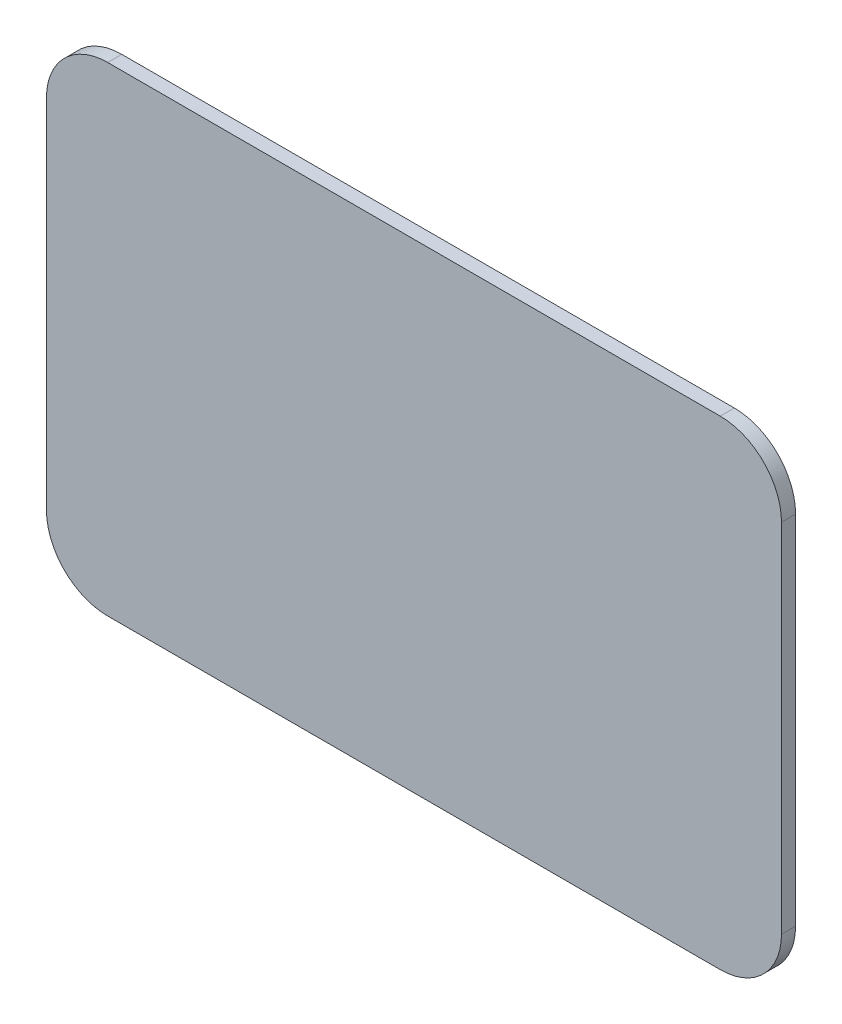
ISO-10303-21;
HEADER;
FILE_DESCRIPTION(('STEP AP214'),'2;1');
FILE_NAME('part.step','',(''),(''),'','','');
FILE_SCHEMA(('AUTOMOTIVE_DESIGN { 1 0 10303 214 1 1 1 1 }'));
ENDSEC;
DATA;
#1=APPLICATION_CONTEXT('core data for automotive mechanical design processes');
#2=APPLICATION_PROTOCOL_DEFINITION('international standard','automotive_design',2000,#1);
#3=PRODUCT_CONTEXT('',#1,'mechanical');
#4=PRODUCT('Part','Part','',(#3));
#5=PRODUCT_RELATED_PRODUCT_CATEGORY('part','',(#4));
#6=PRODUCT_DEFINITION_FORMATION('','',#4);
#7=PRODUCT_DEFINITION_CONTEXT('part definition',#1,'design');
#8=PRODUCT_DEFINITION('design','',#6,#7);
#9=PRODUCT_DEFINITION_SHAPE('','',#8);
#10=(LENGTH_UNIT() NAMED_UNIT(*) SI_UNIT(.MILLI.,.METRE.));
#11=(NAMED_UNIT(*) PLANE_ANGLE_UNIT() SI_UNIT($,.RADIAN.));
#12=(NAMED_UNIT(*) SI_UNIT($,.STERADIAN.) SOLID_ANGLE_UNIT());
#13=UNCERTAINTY_MEASURE_WITH_UNIT(LENGTH_MEASURE(1.E-05),#10,'distance_accuracy_value','');
#14=(GEOMETRIC_REPRESENTATION_CONTEXT(3) GLOBAL_UNCERTAINTY_ASSIGNED_CONTEXT((#13)) GLOBAL_UNIT_ASSIGNED_CONTEXT((#10,
#11,#12)) REPRESENTATION_CONTEXT('',''));
#15=CARTESIAN_POINT('',(0.,0.,0.));
#16=DIRECTION('',(0.,0.,1.));
#17=DIRECTION('',(1.,0.,0.));
#18=AXIS2_PLACEMENT_3D('',#15,#16,#17);
#19=CARTESIAN_POINT('',(-250.,-145.65,-10.));
#20=DIRECTION('',(0.,0.,1.));
#21=DIRECTION('',(1.,0.,0.));
#22=AXIS2_PLACEMENT_3D('',#19,#20,#21);
#23=CYLINDRICAL_SURFACE('',#22,50.);
#24=DIRECTION('',(0.,0.,1.));
#25=VECTOR('',#24,1.);
#26=CARTESIAN_POINT('',(-250.,-195.65,-10.));
#27=LINE('',#26,#25);
#28=CARTESIAN_POINT('',(-250.,-195.65,-10.));
#29=VERTEX_POINT('',#28);
#30=CARTESIAN_POINT('',(-250.,-195.65,1.5));
#31=VERTEX_POINT('',#30);
#32=EDGE_CURVE('E42',#29,#31,#27,.T.);
#33=ORIENTED_EDGE('',*,*,#32,.T.);
#34=CARTESIAN_POINT('',(-250.,-145.65,1.5));
#35=DIRECTION('',(0.,0.,1.));
#36=DIRECTION('',(1.,0.,0.));
#37=AXIS2_PLACEMENT_3D('',#34,#35,#36);
#38=CIRCLE('',#37,50.);
#39=CARTESIAN_POINT('',(-300.,-145.65,1.5));
#40=VERTEX_POINT('',#39);
#41=EDGE_CURVE('E104',#40,#31,#38,.T.);
#42=ORIENTED_EDGE('',*,*,#41,.F.);
#43=DIRECTION('',(0.,0.,1.));
#44=VECTOR('',#43,1.);
#45=CARTESIAN_POINT('',(-300.,-145.65,-10.));
#46=LINE('',#45,#44);
#47=CARTESIAN_POINT('',(-300.,-145.65,-10.));
#48=VERTEX_POINT('',#47);
#49=EDGE_CURVE('E11',#48,#40,#46,.T.);
#50=ORIENTED_EDGE('',*,*,#49,.F.);
#51=CARTESIAN_POINT('',(-250.,-145.65,-10.));
#52=DIRECTION('',(0.,0.,1.));
#53=DIRECTION('',(1.,0.,0.));
#54=AXIS2_PLACEMENT_3D('',#51,#52,#53);
#55=CIRCLE('',#54,50.);
#56=EDGE_CURVE('E105',#48,#29,#55,.T.);
#57=ORIENTED_EDGE('',*,*,#56,.T.);
#58=EDGE_LOOP('',(#33,#42,#50,#57));
#59=FACE_BOUND('',#58,.T.);
#60=ADVANCED_FACE('F39',(#59),#23,.T.);
#61=CARTESIAN_POINT('',(-300.,145.65,-10.));
#62=DIRECTION('',(-1.,0.,0.));
#63=DIRECTION('',(0.,-1.,0.));
#64=AXIS2_PLACEMENT_3D('',#61,#62,#63);
#65=PLANE('',#64);
#66=ORIENTED_EDGE('',*,*,#49,.T.);
#67=DIRECTION('',(0.,-1.,0.));
#68=VECTOR('',#67,1.);
#69=CARTESIAN_POINT('',(-300.,145.65,1.5));
#70=LINE('',#69,#68);
#71=CARTESIAN_POINT('',(-300.,145.65,1.5));
#72=VERTEX_POINT('',#71);
#73=EDGE_CURVE('E124',#72,#40,#70,.T.);
#74=ORIENTED_EDGE('',*,*,#73,.F.);
#75=DIRECTION('',(0.,0.,1.));
#76=VECTOR('',#75,1.);
#77=CARTESIAN_POINT('',(-300.,145.65,-10.));
#78=LINE('',#77,#76);
#79=CARTESIAN_POINT('',(-300.,145.65,-10.));
#80=VERTEX_POINT('',#79);
#81=EDGE_CURVE('E48',#80,#72,#78,.T.);
#82=ORIENTED_EDGE('',*,*,#81,.F.);
#83=DIRECTION('',(0.,-1.,0.));
#84=VECTOR('',#83,1.);
#85=CARTESIAN_POINT('',(-300.,145.65,-10.));
#86=LINE('',#85,#84);
#87=EDGE_CURVE('E111',#80,#48,#86,.T.);
#88=ORIENTED_EDGE('',*,*,#87,.T.);
#89=EDGE_LOOP('',(#66,#74,#82,#88));
#90=FACE_BOUND('',#89,.T.);
#91=ADVANCED_FACE('F209',(#90),#65,.T.);
#92=CARTESIAN_POINT('',(-250.,145.65,-10.));
#93=DIRECTION('',(0.,0.,1.));
#94=DIRECTION('',(1.,0.,0.));
#95=AXIS2_PLACEMENT_3D('',#92,#93,#94);
#96=CYLINDRICAL_SURFACE('',#95,50.);
#97=ORIENTED_EDGE('',*,*,#81,.T.);
#98=CARTESIAN_POINT('',(-250.,145.65,1.5));
#99=DIRECTION('',(0.,0.,1.));
#100=DIRECTION('',(-1.,0.,0.));
#101=AXIS2_PLACEMENT_3D('',#98,#99,#100);
#102=CIRCLE('',#101,50.);
#103=CARTESIAN_POINT('',(-250.,195.65,1.5));
#104=VERTEX_POINT('',#103);
#105=EDGE_CURVE('E142',#104,#72,#102,.T.);
#106=ORIENTED_EDGE('',*,*,#105,.F.);
#107=DIRECTION('',(0.,0.,1.));
#108=VECTOR('',#107,1.);
#109=CARTESIAN_POINT('',(-250.,195.65,-10.));
#110=LINE('',#109,#108);
#111=CARTESIAN_POINT('',(-250.,195.65,-10.));
#112=VERTEX_POINT('',#111);
#113=EDGE_CURVE('E175',#112,#104,#110,.T.);
#114=ORIENTED_EDGE('',*,*,#113,.F.);
#115=CARTESIAN_POINT('',(-250.,145.65,-10.));
#116=DIRECTION('',(0.,0.,1.));
#117=DIRECTION('',(-1.,0.,0.));
#118=AXIS2_PLACEMENT_3D('',#115,#116,#117);
#119=CIRCLE('',#118,50.);
#120=EDGE_CURVE('E168',#112,#80,#119,.T.);
#121=ORIENTED_EDGE('',*,*,#120,.T.);
#122=EDGE_LOOP('',(#97,#106,#114,#121));
#123=FACE_BOUND('',#122,.T.);
#124=ADVANCED_FACE('F208',(#123),#96,.T.);
#125=CARTESIAN_POINT('',(250.,195.65,-10.));
#126=DIRECTION('',(0.,1.,0.));
#127=DIRECTION('',(-1.,0.,0.));
#128=AXIS2_PLACEMENT_3D('',#125,#126,#127);
#129=PLANE('',#128);
#130=ORIENTED_EDGE('',*,*,#113,.T.);
#131=DIRECTION('',(-1.,0.,0.));
#132=VECTOR('',#131,1.);
#133=CARTESIAN_POINT('',(250.,195.65,1.5));
#134=LINE('',#133,#132);
#135=CARTESIAN_POINT('',(250.,195.65,1.5));
#136=VERTEX_POINT('',#135);
#137=EDGE_CURVE('E138',#136,#104,#134,.T.);
#138=ORIENTED_EDGE('',*,*,#137,.F.);
#139=DIRECTION('',(0.,0.,1.));
#140=VECTOR('',#139,1.);
#141=CARTESIAN_POINT('',(250.,195.65,-10.));
#142=LINE('',#141,#140);
#143=CARTESIAN_POINT('',(250.,195.65,-10.));
#144=VERTEX_POINT('',#143);
#145=EDGE_CURVE('E178',#144,#136,#142,.T.);
#146=ORIENTED_EDGE('',*,*,#145,.F.);
#147=DIRECTION('',(-1.,0.,0.));
#148=VECTOR('',#147,1.);
#149=CARTESIAN_POINT('',(250.,195.65,-10.));
#150=LINE('',#149,#148);
#151=EDGE_CURVE('E164',#144,#112,#150,.T.);
#152=ORIENTED_EDGE('',*,*,#151,.T.);
#153=EDGE_LOOP('',(#130,#138,#146,#152));
#154=FACE_BOUND('',#153,.T.);
#155=ADVANCED_FACE('F204',(#154),#129,.T.);
#156=CARTESIAN_POINT('',(250.,145.65,-10.));
#157=DIRECTION('',(0.,0.,1.));
#158=DIRECTION('',(1.,0.,0.));
#159=AXIS2_PLACEMENT_3D('',#156,#157,#158);
#160=CYLINDRICAL_SURFACE('',#159,50.);
#161=ORIENTED_EDGE('',*,*,#145,.T.);
#162=CARTESIAN_POINT('',(250.,145.65,1.5));
#163=DIRECTION('',(0.,0.,1.));
#164=DIRECTION('',(-1.,0.,0.));
#165=AXIS2_PLACEMENT_3D('',#162,#163,#164);
#166=CIRCLE('',#165,50.);
#167=CARTESIAN_POINT('',(300.,145.65,1.5));
#168=VERTEX_POINT('',#167);
#169=EDGE_CURVE('E134',#168,#136,#166,.T.);
#170=ORIENTED_EDGE('',*,*,#169,.F.);
#171=DIRECTION('',(0.,0.,1.));
#172=VECTOR('',#171,1.);
#173=CARTESIAN_POINT('',(300.,145.65,-10.));
#174=LINE('',#173,#172);
#175=CARTESIAN_POINT('',(300.,145.65,-10.));
#176=VERTEX_POINT('',#175);
#177=EDGE_CURVE('E181',#176,#168,#174,.T.);
#178=ORIENTED_EDGE('',*,*,#177,.F.);
#179=CARTESIAN_POINT('',(250.,145.65,-10.));
#180=DIRECTION('',(0.,0.,1.));
#181=DIRECTION('',(-1.,0.,0.));
#182=AXIS2_PLACEMENT_3D('',#179,#180,#181);
#183=CIRCLE('',#182,50.);
#184=EDGE_CURVE('E160',#176,#144,#183,.T.);
#185=ORIENTED_EDGE('',*,*,#184,.T.);
#186=EDGE_LOOP('',(#161,#170,#178,#185));
#187=FACE_BOUND('',#186,.T.);
#188=ADVANCED_FACE('F197',(#187),#160,.T.);
#189=CARTESIAN_POINT('',(300.,145.65,-10.));
#190=DIRECTION('',(1.,0.,0.));
#191=DIRECTION('',(0.,0.,-1.));
#192=AXIS2_PLACEMENT_3D('',#189,#190,#191);
#193=PLANE('',#192);
#194=ORIENTED_EDGE('',*,*,#177,.T.);
#195=DIRECTION('',(0.,1.,0.));
#196=VECTOR('',#195,1.);
#197=CARTESIAN_POINT('',(300.,145.65,1.5));
#198=LINE('',#197,#196);
#199=CARTESIAN_POINT('',(300.,-145.65,1.5));
#200=VERTEX_POINT('',#199);
#201=EDGE_CURVE('E130',#200,#168,#198,.T.);
#202=ORIENTED_EDGE('',*,*,#201,.F.);
#203=DIRECTION('',(0.,0.,1.));
#204=VECTOR('',#203,1.);
#205=CARTESIAN_POINT('',(300.,-145.65,-10.));
#206=LINE('',#205,#204);
#207=CARTESIAN_POINT('',(300.,-145.65,-10.));
#208=VERTEX_POINT('',#207);
#209=EDGE_CURVE('E184',#208,#200,#206,.T.);
#210=ORIENTED_EDGE('',*,*,#209,.F.);
#211=DIRECTION('',(0.,1.,0.));
#212=VECTOR('',#211,1.);
#213=CARTESIAN_POINT('',(300.,145.65,-10.));
#214=LINE('',#213,#212);
#215=EDGE_CURVE('E156',#208,#176,#214,.T.);
#216=ORIENTED_EDGE('',*,*,#215,.T.);
#217=EDGE_LOOP('',(#194,#202,#210,#216));
#218=FACE_BOUND('',#217,.T.);
#219=ADVANCED_FACE('F194',(#218),#193,.T.);
#220=CARTESIAN_POINT('',(250.,-145.65,-10.));
#221=DIRECTION('',(0.,0.,1.));
#222=DIRECTION('',(1.,0.,0.));
#223=AXIS2_PLACEMENT_3D('',#220,#221,#222);
#224=CYLINDRICAL_SURFACE('',#223,50.);
#225=ORIENTED_EDGE('',*,*,#209,.T.);
#226=CARTESIAN_POINT('',(250.,-145.65,1.5));
#227=DIRECTION('',(0.,0.,1.));
#228=DIRECTION('',(1.,0.,0.));
#229=AXIS2_PLACEMENT_3D('',#226,#227,#228);
#230=CIRCLE('',#229,50.);
#231=CARTESIAN_POINT('',(250.,-195.65,1.5));
#232=VERTEX_POINT('',#231);
#233=EDGE_CURVE('E119',#232,#200,#230,.T.);
#234=ORIENTED_EDGE('',*,*,#233,.F.);
#235=DIRECTION('',(0.,0.,1.));
#236=VECTOR('',#235,1.);
#237=CARTESIAN_POINT('',(250.,-195.65,-10.));
#238=LINE('',#237,#236);
#239=CARTESIAN_POINT('',(250.,-195.65,-10.));
#240=VERTEX_POINT('',#239);
#241=EDGE_CURVE('E110',#240,#232,#238,.T.);
#242=ORIENTED_EDGE('',*,*,#241,.F.);
#243=CARTESIAN_POINT('',(250.,-145.65,-10.));
#244=DIRECTION('',(0.,0.,1.));
#245=DIRECTION('',(1.,0.,0.));
#246=AXIS2_PLACEMENT_3D('',#243,#244,#245);
#247=CIRCLE('',#246,50.);
#248=EDGE_CURVE('E152',#240,#208,#247,.T.);
#249=ORIENTED_EDGE('',*,*,#248,.T.);
#250=EDGE_LOOP('',(#225,#234,#242,#249));
#251=FACE_BOUND('',#250,.T.);
#252=ADVANCED_FACE('F188',(#251),#224,.T.);
#253=CARTESIAN_POINT('',(250.,-195.65,-10.));
#254=DIRECTION('',(0.,-1.,0.));
#255=DIRECTION('',(1.,0.,0.));
#256=AXIS2_PLACEMENT_3D('',#253,#254,#255);
#257=PLANE('',#256);
#258=ORIENTED_EDGE('',*,*,#241,.T.);
#259=DIRECTION('',(1.,0.,0.));
#260=VECTOR('',#259,1.);
#261=CARTESIAN_POINT('',(250.,-195.65,1.5));
#262=LINE('',#261,#260);
#263=EDGE_CURVE('E113',#31,#232,#262,.T.);
#264=ORIENTED_EDGE('',*,*,#263,.F.);
#265=ORIENTED_EDGE('',*,*,#32,.F.);
#266=DIRECTION('',(1.,0.,0.));
#267=VECTOR('',#266,1.);
#268=CARTESIAN_POINT('',(250.,-195.65,-10.));
#269=LINE('',#268,#267);
#270=EDGE_CURVE('E149',#29,#240,#269,.T.);
#271=ORIENTED_EDGE('',*,*,#270,.T.);
#272=EDGE_LOOP('',(#258,#264,#265,#271));
#273=FACE_BOUND('',#272,.T.);
#274=ADVANCED_FACE('F114',(#273),#257,.T.);
#275=CARTESIAN_POINT('',(-250.,-145.65,-10.));
#276=DIRECTION('',(0.,0.,1.));
#277=DIRECTION('',(1.,0.,0.));
#278=AXIS2_PLACEMENT_3D('',#275,#276,#277);
#279=PLANE('',#278);
#280=ORIENTED_EDGE('',*,*,#56,.F.);
#281=ORIENTED_EDGE('',*,*,#87,.F.);
#282=ORIENTED_EDGE('',*,*,#120,.F.);
#283=ORIENTED_EDGE('',*,*,#151,.F.);
#284=ORIENTED_EDGE('',*,*,#184,.F.);
#285=ORIENTED_EDGE('',*,*,#215,.F.);
#286=ORIENTED_EDGE('',*,*,#248,.F.);
#287=ORIENTED_EDGE('',*,*,#270,.F.);
#288=EDGE_LOOP('',(#280,#281,#282,#283,#284,#285,#286,#287));
#289=FACE_BOUND('',#288,.T.);
#290=ADVANCED_FACE('F200',(#289),#279,.F.);
#291=CARTESIAN_POINT('',(-250.,-145.65,1.5));
#292=DIRECTION('',(0.,0.,1.));
#293=DIRECTION('',(1.,0.,0.));
#294=AXIS2_PLACEMENT_3D('',#291,#292,#293);
#295=PLANE('',#294);
#296=ORIENTED_EDGE('',*,*,#41,.T.);
#297=ORIENTED_EDGE('',*,*,#263,.T.);
#298=ORIENTED_EDGE('',*,*,#233,.T.);
#299=ORIENTED_EDGE('',*,*,#201,.T.);
#300=ORIENTED_EDGE('',*,*,#169,.T.);
#301=ORIENTED_EDGE('',*,*,#137,.T.);
#302=ORIENTED_EDGE('',*,*,#105,.T.);
#303=ORIENTED_EDGE('',*,*,#73,.T.);
#304=EDGE_LOOP('',(#296,#297,#298,#299,#300,#301,#302,#303));
#305=FACE_BOUND('',#304,.T.);
#306=ADVANCED_FACE('F122',(#305),#295,.T.);
#307=CLOSED_SHELL('',(#60,#91,#124,#155,#188,#219,#252,#274,#290,#306));
#308=MANIFOLD_SOLID_BREP('B2',#307);
#309=ADVANCED_BREP_SHAPE_REPRESENTATION('',(#18,#308),#14);
#310=SHAPE_DEFINITION_REPRESENTATION(#9,#309);
ENDSEC;
END-ISO-10303-21;
